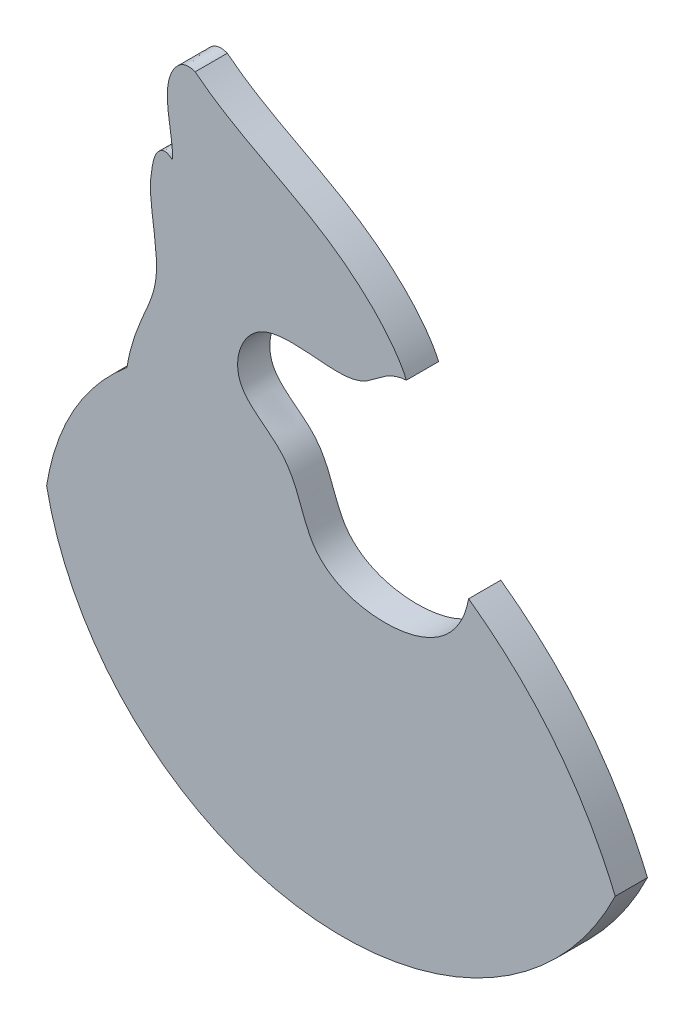
ISO-10303-21;
HEADER;
FILE_DESCRIPTION(('STEP AP214'),'2;1');
FILE_NAME('part.step','',(''),(''),'','','');
FILE_SCHEMA(('AUTOMOTIVE_DESIGN { 1 0 10303 214 1 1 1 1 }'));
ENDSEC;
DATA;
#1=APPLICATION_CONTEXT('core data for automotive mechanical design processes');
#2=APPLICATION_PROTOCOL_DEFINITION('international standard','automotive_design',2000,#1);
#3=PRODUCT_CONTEXT('',#1,'mechanical');
#4=PRODUCT('Part','Part','',(#3));
#5=PRODUCT_RELATED_PRODUCT_CATEGORY('part','',(#4));
#6=PRODUCT_DEFINITION_FORMATION('','',#4);
#7=PRODUCT_DEFINITION_CONTEXT('part definition',#1,'design');
#8=PRODUCT_DEFINITION('design','',#6,#7);
#9=PRODUCT_DEFINITION_SHAPE('','',#8);
#10=(LENGTH_UNIT() NAMED_UNIT(*) SI_UNIT(.MILLI.,.METRE.));
#11=(NAMED_UNIT(*) PLANE_ANGLE_UNIT() SI_UNIT($,.RADIAN.));
#12=(NAMED_UNIT(*) SI_UNIT($,.STERADIAN.) SOLID_ANGLE_UNIT());
#13=UNCERTAINTY_MEASURE_WITH_UNIT(LENGTH_MEASURE(1.E-05),#10,'distance_accuracy_value','');
#14=(GEOMETRIC_REPRESENTATION_CONTEXT(3) GLOBAL_UNCERTAINTY_ASSIGNED_CONTEXT((#13)) GLOBAL_UNIT_ASSIGNED_CONTEXT((#10,
#11,#12)) REPRESENTATION_CONTEXT('',''));
#15=CARTESIAN_POINT('',(0.,0.,0.));
#16=DIRECTION('',(0.,0.,1.));
#17=DIRECTION('',(1.,0.,0.));
#18=AXIS2_PLACEMENT_3D('',#15,#16,#17);
#19=CARTESIAN_POINT('',(0.,0.,0.));
#20=DIRECTION('',(0.,0.,1.));
#21=DIRECTION('',(1.,0.,0.));
#22=AXIS2_PLACEMENT_3D('',#19,#20,#21);
#23=PLANE('',#22);
#24=CARTESIAN_POINT('',(-20.1204658799119,7.73864042031542,0.));
#25=CARTESIAN_POINT('',(-26.312613565063,2.50125985842407,0.));
#26=CARTESIAN_POINT('',(-27.6121037094212,-5.56524584096371,0.));
#27=B_SPLINE_CURVE_WITH_KNOTS('',2,(#24,#25,#26),.UNSPECIFIED.,.F.,.F.,(3,3),(0.,1.),.UNSPECIFIED.);
#28=CARTESIAN_POINT('',(-20.1204658799119,7.73864042031542,0.));
#29=VERTEX_POINT('',#28);
#30=CARTESIAN_POINT('',(-27.6121037094212,-5.56524584096373,0.));
#31=VERTEX_POINT('',#30);
#32=EDGE_CURVE('E123',#29,#31,#27,.T.);
#33=ORIENTED_EDGE('',*,*,#32,.F.);
#34=CARTESIAN_POINT('',(-17.9334301189199,23.8652247649425,0.));
#35=CARTESIAN_POINT('',(-18.0368188136872,21.8765574002032,0.));
#36=CARTESIAN_POINT('',(-16.1776531522545,15.0171848846441,0.));
#37=CARTESIAN_POINT('',(-19.4057315942246,12.1261238864807,0.));
#38=CARTESIAN_POINT('',(-20.1204658799119,7.73864042031542,0.));
#39=B_SPLINE_CURVE_WITH_KNOTS('',3,(#34,#35,#36,#37,#38),.UNSPECIFIED.,.F.,.F.,(4,1,4),(0.,
0.447730161875163,1.),.UNSPECIFIED.);
#40=CARTESIAN_POINT('',(-17.9334301189199,23.8652247649425,0.));
#41=VERTEX_POINT('',#40);
#42=EDGE_CURVE('E63',#41,#29,#39,.T.);
#43=ORIENTED_EDGE('',*,*,#42,.F.);
#44=CARTESIAN_POINT('',(-17.9334301189199,23.8652247649425,0.));
#45=CARTESIAN_POINT('',(-17.7532714079684,25.6948165819611,0.));
#46=CARTESIAN_POINT('',(-17.4507049143558,26.6250581401094,0.));
#47=CARTESIAN_POINT('',(-16.4955992028313,27.0405419914796,0.));
#48=CARTESIAN_POINT('',(-16.1657715925301,26.837002657607,0.));
#49=CARTESIAN_POINT('',(-15.903692173996,26.6159992710045,0.));
#50=B_SPLINE_CURVE_WITH_KNOTS('',3,(#44,#45,#46,#47,#48,#49),.UNSPECIFIED.,.F.,.F.,(4,1,1,4),
(0.,0.587239464657934,0.699785697586481,1.),.UNSPECIFIED.);
#51=CARTESIAN_POINT('',(-15.903692173996,26.6159992710045,0.));
#52=VERTEX_POINT('',#51);
#53=EDGE_CURVE('E113',#41,#52,#50,.T.);
#54=ORIENTED_EDGE('',*,*,#53,.T.);
#55=CARTESIAN_POINT('',(-15.903692173996,26.6159992710045,0.));
#56=CARTESIAN_POINT('',(-15.6558710768199,28.3803298978842,0.));
#57=CARTESIAN_POINT('',(-17.6162227993562,32.9791090030796,0.));
#58=CARTESIAN_POINT('',(-14.65170814551,35.1172811713922,0.));
#59=CARTESIAN_POINT('',(-13.7653612722955,34.7766804040605,0.));
#60=B_SPLINE_CURVE_WITH_KNOTS('',3,(#55,#56,#57,#58,#59),.UNSPECIFIED.,.F.,.F.,(4,1,4),(0.,
0.804322479966874,1.),.UNSPECIFIED.);
#61=CARTESIAN_POINT('',(-13.7653612722955,34.7766804040605,0.));
#62=VERTEX_POINT('',#61);
#63=EDGE_CURVE('E119',#52,#62,#60,.T.);
#64=ORIENTED_EDGE('',*,*,#63,.T.);
#65=CARTESIAN_POINT('',(-13.7653612722955,34.7766804040605,0.));
#66=CARTESIAN_POINT('',(-9.83127308758346,31.633177871468,0.));
#67=CARTESIAN_POINT('',(-1.62147579979506,28.7508695794842,0.));
#68=CARTESIAN_POINT('',(4.89010628277123,22.1505038985995,0.));
#69=CARTESIAN_POINT('',(5.92601830353766,19.7283911654133,0.));
#70=B_SPLINE_CURVE_WITH_KNOTS('',3,(#65,#66,#67,#68,#69),.UNSPECIFIED.,.F.,.F.,(4,1,4),(0.,
0.58658298348041,1.),.UNSPECIFIED.);
#71=CARTESIAN_POINT('',(5.92601830353766,19.7283911654133,0.));
#72=VERTEX_POINT('',#71);
#73=EDGE_CURVE('E144',#62,#72,#70,.T.);
#74=ORIENTED_EDGE('',*,*,#73,.T.);
#75=CARTESIAN_POINT('',(5.92601830353766,19.7283911654133,0.));
#76=CARTESIAN_POINT('',(4.02028251388838,19.5952871792559,0.));
#77=CARTESIAN_POINT('',(2.19902114817598,16.8010466628768,0.));
#78=CARTESIAN_POINT('',(-2.79296891863177,17.3975535529566,0.));
#79=CARTESIAN_POINT('',(-8.81899845256958,17.6334993418143,0.));
#80=CARTESIAN_POINT('',(-11.0345149573054,11.3765862956369,0.));
#81=CARTESIAN_POINT('',(-4.3024448915825,7.99206610464685,0.));
#82=CARTESIAN_POINT('',(-3.51595849447128,0.688577280426405,0.));
#83=CARTESIAN_POINT('',(5.01866802073159,-2.02837444799676,0.));
#84=CARTESIAN_POINT('',(10.9876962598355,0.820406519544929,0.));
#85=CARTESIAN_POINT('',(11.7251253881301,4.98956979877658,0.));
#86=B_SPLINE_CURVE_WITH_KNOTS('',3,(#75,#76,#77,#78,#79,#80,#81,#82,#83,#84,#85),.UNSPECIFIED.,
.F.,.F.,(4,1,1,1,1,1,1,1,4),(0.,0.0942730040172293,0.19928345734627,0.293275805902293,
0.411821869155019,0.50160376366945,0.62725248113282,0.788706935920795,1.),.UNSPECIFIED.);
#87=CARTESIAN_POINT('',(11.7251253881301,4.98956979877658,0.));
#88=VERTEX_POINT('',#87);
#89=EDGE_CURVE('E152',#72,#88,#86,.T.);
#90=ORIENTED_EDGE('',*,*,#89,.T.);
#91=CARTESIAN_POINT('',(11.7251253881301,4.98956979877658,0.));
#92=CARTESIAN_POINT('',(20.9983816568196,-1.65724138169035,0.));
#93=CARTESIAN_POINT('',(25.390863641437,-12.1944362752917,0.));
#94=B_SPLINE_CURVE_WITH_KNOTS('',2,(#91,#92,#93),.UNSPECIFIED.,.F.,.F.,(3,3),(0.,1.),.UNSPECIFIED.);
#95=CARTESIAN_POINT('',(25.390863641437,-12.1944362752917,0.));
#96=VERTEX_POINT('',#95);
#97=EDGE_CURVE('E160',#88,#96,#94,.T.);
#98=ORIENTED_EDGE('',*,*,#97,.T.);
#99=CARTESIAN_POINT('',(0.,0.,0.));
#100=DIRECTION('',(0.,0.,1.));
#101=DIRECTION('',(1.,0.,0.));
#102=AXIS2_PLACEMENT_3D('',#99,#100,#101);
#103=CIRCLE('',#102,28.1673611211664);
#104=EDGE_CURVE('E168',#96,#31,#103,.F.);
#105=ORIENTED_EDGE('',*,*,#104,.T.);
#106=EDGE_LOOP('',(#33,#43,#54,#64,#74,#90,#98,#105));
#107=FACE_BOUND('',#106,.T.);
#108=ADVANCED_FACE('F39',(#107),#23,.F.);
#109=CARTESIAN_POINT('',(-17.9334301189199,23.8652247649425,10.));
#110=CARTESIAN_POINT('',(-18.0368188136872,21.8765574002032,10.));
#111=CARTESIAN_POINT('',(-16.1776531522545,15.0171848846441,10.));
#112=CARTESIAN_POINT('',(-19.4057315942246,12.1261238864807,10.));
#113=CARTESIAN_POINT('',(-20.1204658799119,7.73864042031542,10.));
#114=B_SPLINE_CURVE_WITH_KNOTS('',3,(#109,#110,#111,#112,#113),.UNSPECIFIED.,.F.,.F.,(4,1,4),
(0.,0.447730161875163,1.),.UNSPECIFIED.);
#115=DIRECTION('',(0.,0.,-1.));
#116=VECTOR('',#115,1.);
#117=SURFACE_OF_LINEAR_EXTRUSION('',#114,#116);
#118=CARTESIAN_POINT('',(-17.9334301189199,23.8652247649425,3.));
#119=CARTESIAN_POINT('',(-18.0368188136872,21.8765574002032,3.));
#120=CARTESIAN_POINT('',(-16.1776531522545,15.0171848846441,3.));
#121=CARTESIAN_POINT('',(-19.4057315942246,12.1261238864807,3.));
#122=CARTESIAN_POINT('',(-20.1204658799119,7.73864042031542,3.));
#123=B_SPLINE_CURVE_WITH_KNOTS('',3,(#118,#119,#120,#121,#122),.UNSPECIFIED.,.F.,.F.,(4,1,4),
(0.,0.447730161875163,1.),.UNSPECIFIED.);
#124=CARTESIAN_POINT('',(-20.1204658799119,7.73864042031542,3.));
#125=VERTEX_POINT('',#124);
#126=CARTESIAN_POINT('',(-17.9334301189199,23.8652247649425,3.));
#127=VERTEX_POINT('',#126);
#128=EDGE_CURVE('E11',#125,#127,#123,.F.);
#129=ORIENTED_EDGE('',*,*,#128,.T.);
#130=DIRECTION('',(0.,0.,-1.));
#131=VECTOR('',#130,1.);
#132=CARTESIAN_POINT('',(-17.9334301189199,23.8652247649425,10.));
#133=LINE('',#132,#131);
#134=EDGE_CURVE('E103',#127,#41,#133,.T.);
#135=ORIENTED_EDGE('',*,*,#134,.T.);
#136=ORIENTED_EDGE('',*,*,#42,.T.);
#137=DIRECTION('',(0.,0.,-1.));
#138=VECTOR('',#137,1.);
#139=CARTESIAN_POINT('',(-20.1204658799119,7.73864042031542,10.));
#140=LINE('',#139,#138);
#141=EDGE_CURVE('E176',#125,#29,#140,.T.);
#142=ORIENTED_EDGE('',*,*,#141,.F.);
#143=EDGE_LOOP('',(#129,#135,#136,#142));
#144=FACE_BOUND('',#143,.T.);
#145=ADVANCED_FACE('F105',(#144),#117,.F.);
#146=CARTESIAN_POINT('',(-17.9334301189199,23.8652247649425,10.));
#147=CARTESIAN_POINT('',(-17.7532714079684,25.6948165819611,10.));
#148=CARTESIAN_POINT('',(-17.4507049143558,26.6250581401094,10.));
#149=CARTESIAN_POINT('',(-16.4955992028313,27.0405419914796,10.));
#150=CARTESIAN_POINT('',(-16.1657715925301,26.837002657607,10.));
#151=CARTESIAN_POINT('',(-15.903692173996,26.6159992710045,10.));
#152=B_SPLINE_CURVE_WITH_KNOTS('',3,(#146,#147,#148,#149,#150,#151),.UNSPECIFIED.,.F.,.F.,(4,1,
1,4),(0.,0.587239464657934,0.699785697586481,1.),.UNSPECIFIED.);
#153=DIRECTION('',(0.,0.,-1.));
#154=VECTOR('',#153,1.);
#155=SURFACE_OF_LINEAR_EXTRUSION('',#152,#154);
#156=DIRECTION('',(0.,0.,-1.));
#157=VECTOR('',#156,1.);
#158=CARTESIAN_POINT('',(-15.903692173996,26.6159992710045,10.));
#159=LINE('',#158,#157);
#160=CARTESIAN_POINT('',(-15.903692173996,26.6159992710045,3.));
#161=VERTEX_POINT('',#160);
#162=EDGE_CURVE('E110',#161,#52,#159,.T.);
#163=ORIENTED_EDGE('',*,*,#162,.T.);
#164=ORIENTED_EDGE('',*,*,#53,.F.);
#165=ORIENTED_EDGE('',*,*,#134,.F.);
#166=CARTESIAN_POINT('',(-17.9334301189199,23.8652247649425,3.));
#167=CARTESIAN_POINT('',(-17.7532714079684,25.6948165819611,3.));
#168=CARTESIAN_POINT('',(-17.4507049143558,26.6250581401094,3.));
#169=CARTESIAN_POINT('',(-16.4955992028313,27.0405419914796,3.));
#170=CARTESIAN_POINT('',(-16.1657715925301,26.837002657607,3.));
#171=CARTESIAN_POINT('',(-15.903692173996,26.6159992710045,3.));
#172=B_SPLINE_CURVE_WITH_KNOTS('',3,(#166,#167,#168,#169,#170,#171),.UNSPECIFIED.,.F.,.F.,(4,1,
1,4),(0.,0.587239464657934,0.699785697586481,1.),.UNSPECIFIED.);
#173=EDGE_CURVE('E48',#161,#127,#172,.F.);
#174=ORIENTED_EDGE('',*,*,#173,.F.);
#175=EDGE_LOOP('',(#163,#164,#165,#174));
#176=FACE_BOUND('',#175,.T.);
#177=ADVANCED_FACE('F114',(#176),#155,.T.);
#178=CARTESIAN_POINT('',(-15.903692173996,26.6159992710045,10.));
#179=CARTESIAN_POINT('',(-15.6558710768199,28.3803298978842,10.));
#180=CARTESIAN_POINT('',(-17.6162227993562,32.9791090030796,10.));
#181=CARTESIAN_POINT('',(-14.65170814551,35.1172811713922,10.));
#182=CARTESIAN_POINT('',(-13.7653612722955,34.7766804040605,10.));
#183=B_SPLINE_CURVE_WITH_KNOTS('',3,(#178,#179,#180,#181,#182),.UNSPECIFIED.,.F.,.F.,(4,1,4),
(0.,0.804322479966874,1.),.UNSPECIFIED.);
#184=DIRECTION('',(0.,0.,-1.));
#185=VECTOR('',#184,1.);
#186=SURFACE_OF_LINEAR_EXTRUSION('',#183,#185);
#187=DIRECTION('',(0.,0.,-1.));
#188=VECTOR('',#187,1.);
#189=CARTESIAN_POINT('',(-13.7653612722955,34.7766804040605,10.));
#190=LINE('',#189,#188);
#191=CARTESIAN_POINT('',(-13.7653612722955,34.7766804040605,3.));
#192=VERTEX_POINT('',#191);
#193=EDGE_CURVE('E188',#192,#62,#190,.T.);
#194=ORIENTED_EDGE('',*,*,#193,.T.);
#195=ORIENTED_EDGE('',*,*,#63,.F.);
#196=ORIENTED_EDGE('',*,*,#162,.F.);
#197=CARTESIAN_POINT('',(-15.903692173996,26.6159992710045,3.));
#198=CARTESIAN_POINT('',(-15.6558710768199,28.3803298978842,3.));
#199=CARTESIAN_POINT('',(-17.6162227993562,32.9791090030796,3.));
#200=CARTESIAN_POINT('',(-14.65170814551,35.1172811713922,3.));
#201=CARTESIAN_POINT('',(-13.7653612722955,34.7766804040605,3.));
#202=B_SPLINE_CURVE_WITH_KNOTS('',3,(#197,#198,#199,#200,#201),.UNSPECIFIED.,.F.,.F.,(4,1,4),
(0.,0.804322479966874,1.),.UNSPECIFIED.);
#203=EDGE_CURVE('E221',#192,#161,#202,.F.);
#204=ORIENTED_EDGE('',*,*,#203,.F.);
#205=EDGE_LOOP('',(#194,#195,#196,#204));
#206=FACE_BOUND('',#205,.T.);
#207=ADVANCED_FACE('F240',(#206),#186,.T.);
#208=CARTESIAN_POINT('',(-13.7653612722955,34.7766804040605,10.));
#209=CARTESIAN_POINT('',(-9.83127308758346,31.633177871468,10.));
#210=CARTESIAN_POINT('',(-1.62147579979506,28.7508695794842,10.));
#211=CARTESIAN_POINT('',(4.89010628277123,22.1505038985995,10.));
#212=CARTESIAN_POINT('',(5.92601830353766,19.7283911654133,10.));
#213=B_SPLINE_CURVE_WITH_KNOTS('',3,(#208,#209,#210,#211,#212),.UNSPECIFIED.,.F.,.F.,(4,1,4),
(0.,0.58658298348041,1.),.UNSPECIFIED.);
#214=DIRECTION('',(0.,0.,-1.));
#215=VECTOR('',#214,1.);
#216=SURFACE_OF_LINEAR_EXTRUSION('',#213,#215);
#217=DIRECTION('',(0.,0.,-1.));
#218=VECTOR('',#217,1.);
#219=CARTESIAN_POINT('',(5.92601830353766,19.7283911654133,10.));
#220=LINE('',#219,#218);
#221=CARTESIAN_POINT('',(5.92601830353766,19.7283911654133,3.));
#222=VERTEX_POINT('',#221);
#223=EDGE_CURVE('E186',#222,#72,#220,.T.);
#224=ORIENTED_EDGE('',*,*,#223,.T.);
#225=ORIENTED_EDGE('',*,*,#73,.F.);
#226=ORIENTED_EDGE('',*,*,#193,.F.);
#227=CARTESIAN_POINT('',(-13.7653612722955,34.7766804040605,3.));
#228=CARTESIAN_POINT('',(-9.83127308758346,31.633177871468,3.));
#229=CARTESIAN_POINT('',(-1.62147579979506,28.7508695794842,3.));
#230=CARTESIAN_POINT('',(4.89010628277123,22.1505038985995,3.));
#231=CARTESIAN_POINT('',(5.92601830353766,19.7283911654133,3.));
#232=B_SPLINE_CURVE_WITH_KNOTS('',3,(#227,#228,#229,#230,#231),.UNSPECIFIED.,.F.,.F.,(4,1,4),
(0.,0.58658298348041,1.),.UNSPECIFIED.);
#233=EDGE_CURVE('E213',#222,#192,#232,.F.);
#234=ORIENTED_EDGE('',*,*,#233,.F.);
#235=EDGE_LOOP('',(#224,#225,#226,#234));
#236=FACE_BOUND('',#235,.T.);
#237=ADVANCED_FACE('F245',(#236),#216,.T.);
#238=CARTESIAN_POINT('',(5.92601830353766,19.7283911654133,10.));
#239=CARTESIAN_POINT('',(4.02028251388838,19.5952871792559,10.));
#240=CARTESIAN_POINT('',(2.19902114817598,16.8010466628768,10.));
#241=CARTESIAN_POINT('',(-2.79296891863177,17.3975535529566,10.));
#242=CARTESIAN_POINT('',(-8.81899845256958,17.6334993418143,10.));
#243=CARTESIAN_POINT('',(-11.0345149573054,11.3765862956369,10.));
#244=CARTESIAN_POINT('',(-4.3024448915825,7.99206610464685,10.));
#245=CARTESIAN_POINT('',(-3.51595849447128,0.688577280426405,10.));
#246=CARTESIAN_POINT('',(5.01866802073159,-2.02837444799676,10.));
#247=CARTESIAN_POINT('',(10.9876962598355,0.820406519544929,10.));
#248=CARTESIAN_POINT('',(11.7251253881301,4.98956979877658,10.));
#249=B_SPLINE_CURVE_WITH_KNOTS('',3,(#238,#239,#240,#241,#242,#243,#244,#245,#246,#247,#248),
.UNSPECIFIED.,.F.,.F.,(4,1,1,1,1,1,1,1,4),(0.,0.0942730040172293,0.19928345734627,
0.293275805902293,0.411821869155019,0.50160376366945,0.62725248113282,0.788706935920795,1.),.UNSPECIFIED.);
#250=DIRECTION('',(0.,0.,-1.));
#251=VECTOR('',#250,1.);
#252=SURFACE_OF_LINEAR_EXTRUSION('',#249,#251);
#253=DIRECTION('',(0.,0.,-1.));
#254=VECTOR('',#253,1.);
#255=CARTESIAN_POINT('',(11.7251253881301,4.98956979877658,10.));
#256=LINE('',#255,#254);
#257=CARTESIAN_POINT('',(11.7251253881301,4.98956979877658,3.));
#258=VERTEX_POINT('',#257);
#259=EDGE_CURVE('E184',#258,#88,#256,.T.);
#260=ORIENTED_EDGE('',*,*,#259,.T.);
#261=ORIENTED_EDGE('',*,*,#89,.F.);
#262=ORIENTED_EDGE('',*,*,#223,.F.);
#263=CARTESIAN_POINT('',(5.92601830353766,19.7283911654133,3.));
#264=CARTESIAN_POINT('',(4.02028251388838,19.5952871792559,3.));
#265=CARTESIAN_POINT('',(2.19902114817598,16.8010466628768,3.));
#266=CARTESIAN_POINT('',(-2.79296891863177,17.3975535529566,3.));
#267=CARTESIAN_POINT('',(-8.81899845256958,17.6334993418143,3.));
#268=CARTESIAN_POINT('',(-11.0345149573054,11.3765862956369,3.));
#269=CARTESIAN_POINT('',(-4.3024448915825,7.99206610464685,3.));
#270=CARTESIAN_POINT('',(-3.51595849447128,0.688577280426405,3.));
#271=CARTESIAN_POINT('',(5.01866802073159,-2.02837444799676,3.));
#272=CARTESIAN_POINT('',(10.9876962598355,0.820406519544929,3.));
#273=CARTESIAN_POINT('',(11.7251253881301,4.98956979877658,3.));
#274=B_SPLINE_CURVE_WITH_KNOTS('',3,(#263,#264,#265,#266,#267,#268,#269,#270,#271,#272,#273),
.UNSPECIFIED.,.F.,.F.,(4,1,1,1,1,1,1,1,4),(0.,0.0942730040172293,0.19928345734627,
0.293275805902293,0.411821869155019,0.50160376366945,0.62725248113282,0.788706935920795,1.),.UNSPECIFIED.);
#275=EDGE_CURVE('E205',#258,#222,#274,.F.);
#276=ORIENTED_EDGE('',*,*,#275,.F.);
#277=EDGE_LOOP('',(#260,#261,#262,#276));
#278=FACE_BOUND('',#277,.T.);
#279=ADVANCED_FACE('F248',(#278),#252,.T.);
#280=CARTESIAN_POINT('',(11.7251253881301,4.98956979877658,10.));
#281=CARTESIAN_POINT('',(20.9983816568196,-1.65724138169035,10.));
#282=CARTESIAN_POINT('',(25.390863641437,-12.1944362752917,10.));
#283=B_SPLINE_CURVE_WITH_KNOTS('',2,(#280,#281,#282),.UNSPECIFIED.,.F.,.F.,(3,3),(0.,1.),.UNSPECIFIED.);
#284=DIRECTION('',(0.,0.,-1.));
#285=VECTOR('',#284,1.);
#286=SURFACE_OF_LINEAR_EXTRUSION('',#283,#285);
#287=DIRECTION('',(0.,0.,-1.));
#288=VECTOR('',#287,1.);
#289=CARTESIAN_POINT('',(25.390863641437,-12.1944362752917,10.));
#290=LINE('',#289,#288);
#291=CARTESIAN_POINT('',(25.390863641437,-12.1944362752917,3.));
#292=VERTEX_POINT('',#291);
#293=EDGE_CURVE('E182',#292,#96,#290,.T.);
#294=ORIENTED_EDGE('',*,*,#293,.T.);
#295=ORIENTED_EDGE('',*,*,#97,.F.);
#296=ORIENTED_EDGE('',*,*,#259,.F.);
#297=CARTESIAN_POINT('',(11.7251253881301,4.98956979877658,3.));
#298=CARTESIAN_POINT('',(20.9983816568196,-1.65724138169035,3.));
#299=CARTESIAN_POINT('',(25.390863641437,-12.1944362752917,3.));
#300=B_SPLINE_CURVE_WITH_KNOTS('',2,(#297,#298,#299),.UNSPECIFIED.,.F.,.F.,(3,3),(0.,1.),.UNSPECIFIED.);
#301=EDGE_CURVE('E200',#292,#258,#300,.F.);
#302=ORIENTED_EDGE('',*,*,#301,.F.);
#303=EDGE_LOOP('',(#294,#295,#296,#302));
#304=FACE_BOUND('',#303,.T.);
#305=ADVANCED_FACE('F252',(#304),#286,.T.);
#306=CARTESIAN_POINT('',(0.,0.,10.));
#307=DIRECTION('',(0.,0.,-1.));
#308=DIRECTION('',(-1.,0.,0.));
#309=AXIS2_PLACEMENT_3D('',#306,#307,#308);
#310=CYLINDRICAL_SURFACE('',#309,28.1673611211664);
#311=DIRECTION('',(0.,0.,-1.));
#312=VECTOR('',#311,1.);
#313=CARTESIAN_POINT('',(-27.6121037094212,-5.56524584096373,10.));
#314=LINE('',#313,#312);
#315=CARTESIAN_POINT('',(-27.6121037094212,-5.56524584096371,3.));
#316=VERTEX_POINT('',#315);
#317=EDGE_CURVE('E55',#316,#31,#314,.T.);
#318=ORIENTED_EDGE('',*,*,#317,.T.);
#319=ORIENTED_EDGE('',*,*,#104,.F.);
#320=ORIENTED_EDGE('',*,*,#293,.F.);
#321=CARTESIAN_POINT('',(0.,0.,3.));
#322=DIRECTION('',(0.,0.,1.));
#323=DIRECTION('',(1.,0.,0.));
#324=AXIS2_PLACEMENT_3D('',#321,#322,#323);
#325=CIRCLE('',#324,28.1673611211664);
#326=EDGE_CURVE('E194',#316,#292,#325,.T.);
#327=ORIENTED_EDGE('',*,*,#326,.F.);
#328=EDGE_LOOP('',(#318,#319,#320,#327));
#329=FACE_BOUND('',#328,.T.);
#330=ADVANCED_FACE('F256',(#329),#310,.T.);
#331=CARTESIAN_POINT('',(-20.1204658799119,7.73864042031542,10.));
#332=CARTESIAN_POINT('',(-26.312613565063,2.50125985842407,10.));
#333=CARTESIAN_POINT('',(-27.6121037094212,-5.56524584096371,10.));
#334=B_SPLINE_CURVE_WITH_KNOTS('',2,(#331,#332,#333),.UNSPECIFIED.,.F.,.F.,(3,3),(0.,1.),.UNSPECIFIED.);
#335=DIRECTION('',(0.,0.,-1.));
#336=VECTOR('',#335,1.);
#337=SURFACE_OF_LINEAR_EXTRUSION('',#334,#336);
#338=CARTESIAN_POINT('',(-20.1204658799119,7.73864042031542,3.));
#339=CARTESIAN_POINT('',(-26.312613565063,2.50125985842407,3.));
#340=CARTESIAN_POINT('',(-27.6121037094212,-5.56524584096371,3.));
#341=B_SPLINE_CURVE_WITH_KNOTS('',2,(#338,#339,#340),.UNSPECIFIED.,.F.,.F.,(3,3),(0.,1.),.UNSPECIFIED.);
#342=EDGE_CURVE('E109',#316,#125,#341,.F.);
#343=ORIENTED_EDGE('',*,*,#342,.T.);
#344=ORIENTED_EDGE('',*,*,#141,.T.);
#345=ORIENTED_EDGE('',*,*,#32,.T.);
#346=ORIENTED_EDGE('',*,*,#317,.F.);
#347=EDGE_LOOP('',(#343,#344,#345,#346));
#348=FACE_BOUND('',#347,.T.);
#349=ADVANCED_FACE('F257',(#348),#337,.F.);
#350=CARTESIAN_POINT('',(0.,0.,3.));
#351=DIRECTION('',(0.,0.,1.));
#352=DIRECTION('',(1.,0.,0.));
#353=AXIS2_PLACEMENT_3D('',#350,#351,#352);
#354=PLANE('',#353);
#355=ORIENTED_EDGE('',*,*,#128,.F.);
#356=ORIENTED_EDGE('',*,*,#342,.F.);
#357=ORIENTED_EDGE('',*,*,#326,.T.);
#358=ORIENTED_EDGE('',*,*,#301,.T.);
#359=ORIENTED_EDGE('',*,*,#275,.T.);
#360=ORIENTED_EDGE('',*,*,#233,.T.);
#361=ORIENTED_EDGE('',*,*,#203,.T.);
#362=ORIENTED_EDGE('',*,*,#173,.T.);
#363=EDGE_LOOP('',(#355,#356,#357,#358,#359,#360,#361,#362));
#364=FACE_BOUND('',#363,.T.);
#365=ADVANCED_FACE('F237',(#364),#354,.T.);
#366=CLOSED_SHELL('',(#108,#145,#177,#207,#237,#279,#305,#330,#349,#365));
#367=MANIFOLD_SOLID_BREP('B2',#366);
#368=ADVANCED_BREP_SHAPE_REPRESENTATION('',(#18,#367),#14);
#369=SHAPE_DEFINITION_REPRESENTATION(#9,#368);
ENDSEC;
END-ISO-10303-21;
